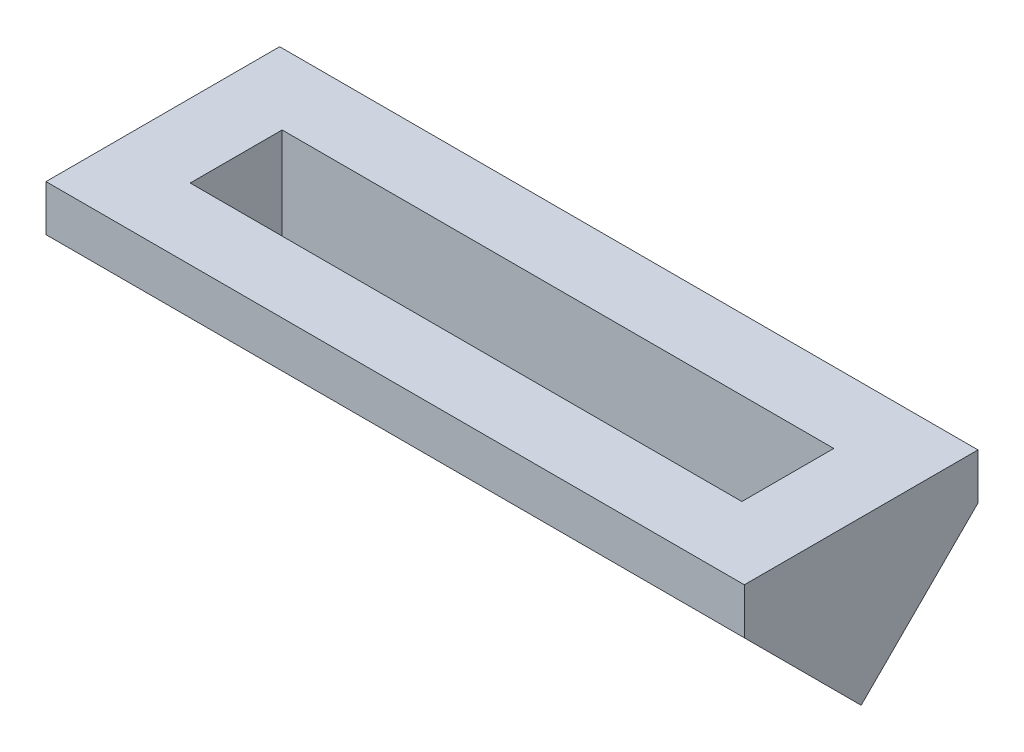
ISO-10303-21;
HEADER;
FILE_DESCRIPTION(('STEP AP214'),'2;1');
FILE_NAME('part.step','',(''),(''),'','','');
FILE_SCHEMA(('AUTOMOTIVE_DESIGN { 1 0 10303 214 1 1 1 1 }'));
ENDSEC;
DATA;
#1=APPLICATION_CONTEXT('core data for automotive mechanical design processes');
#2=APPLICATION_PROTOCOL_DEFINITION('international standard','automotive_design',2000,#1);
#3=PRODUCT_CONTEXT('',#1,'mechanical');
#4=PRODUCT('Part','Part','',(#3));
#5=PRODUCT_RELATED_PRODUCT_CATEGORY('part','',(#4));
#6=PRODUCT_DEFINITION_FORMATION('','',#4);
#7=PRODUCT_DEFINITION_CONTEXT('part definition',#1,'design');
#8=PRODUCT_DEFINITION('design','',#6,#7);
#9=PRODUCT_DEFINITION_SHAPE('','',#8);
#10=(LENGTH_UNIT() NAMED_UNIT(*) SI_UNIT(.MILLI.,.METRE.));
#11=(NAMED_UNIT(*) PLANE_ANGLE_UNIT() SI_UNIT($,.RADIAN.));
#12=(NAMED_UNIT(*) SI_UNIT($,.STERADIAN.) SOLID_ANGLE_UNIT());
#13=UNCERTAINTY_MEASURE_WITH_UNIT(LENGTH_MEASURE(1.E-05),#10,'distance_accuracy_value','');
#14=(GEOMETRIC_REPRESENTATION_CONTEXT(3) GLOBAL_UNCERTAINTY_ASSIGNED_CONTEXT((#13)) GLOBAL_UNIT_ASSIGNED_CONTEXT((#10,
#11,#12)) REPRESENTATION_CONTEXT('',''));
#15=CARTESIAN_POINT('',(0.,0.,0.));
#16=DIRECTION('',(0.,0.,1.));
#17=DIRECTION('',(1.,0.,0.));
#18=AXIS2_PLACEMENT_3D('',#15,#16,#17);
#19=CARTESIAN_POINT('',(0.,-50.8,5.82832430434869));
#20=DIRECTION('',(0.,0.707106781186546,0.707106781186548));
#21=DIRECTION('',(1.,0.,0.));
#22=AXIS2_PLACEMENT_3D('',#19,#20,#21);
#23=PLANE('',#22);
#24=DIRECTION('',(-1.,0.,0.));
#25=VECTOR('',#24,1.);
#26=CARTESIAN_POINT('',(0.,-44.9716756956512,0.));
#27=LINE('',#26,#25);
#28=CARTESIAN_POINT('',(-96.460563282851,-44.9716756956512,0.));
#29=VERTEX_POINT('',#28);
#30=CARTESIAN_POINT('',(96.460563282851,-44.9716756956512,0.));
#31=VERTEX_POINT('',#30);
#32=EDGE_CURVE('E200',#29,#31,#27,.F.);
#33=ORIENTED_EDGE('',*,*,#32,.F.);
#34=DIRECTION('',(0.,0.707106781186549,-0.707106781186546));
#35=VECTOR('',#34,1.);
#36=CARTESIAN_POINT('',(-96.460563282851,-50.8,5.82832430434869));
#37=LINE('',#36,#35);
#38=CARTESIAN_POINT('',(-96.460563282851,-12.6999999999998,-32.2716756956514));
#39=VERTEX_POINT('',#38);
#40=EDGE_CURVE('E239',#39,#29,#37,.F.);
#41=ORIENTED_EDGE('',*,*,#40,.F.);
#42=DIRECTION('',(-1.,0.,0.));
#43=VECTOR('',#42,1.);
#44=CARTESIAN_POINT('',(0.,-12.6999999999998,-32.2716756956514));
#45=LINE('',#44,#43);
#46=CARTESIAN_POINT('',(96.460563282851,-12.6999999999998,-32.2716756956514));
#47=VERTEX_POINT('',#46);
#48=EDGE_CURVE('E245',#47,#39,#45,.T.);
#49=ORIENTED_EDGE('',*,*,#48,.F.);
#50=DIRECTION('',(0.,-0.707106781186549,0.707106781186546));
#51=VECTOR('',#50,1.);
#52=CARTESIAN_POINT('',(96.460563282851,-47.8858378478256,2.91416215217436));
#53=LINE('',#52,#51);
#54=EDGE_CURVE('E233',#31,#47,#53,.F.);
#55=ORIENTED_EDGE('',*,*,#54,.F.);
#56=EDGE_LOOP('',(#33,#41,#49,#55));
#57=FACE_BOUND('',#56,.T.);
#58=DIRECTION('',(1.,0.,0.));
#59=VECTOR('',#58,1.);
#60=CARTESIAN_POINT('',(0.,-32.2716756956512,-12.7));
#61=LINE('',#60,#59);
#62=CARTESIAN_POINT('',(76.2,-32.2716756956513,-12.7));
#63=VERTEX_POINT('',#62);
#64=CARTESIAN_POINT('',(-76.2,-32.2716756956512,-12.7));
#65=VERTEX_POINT('',#64);
#66=EDGE_CURVE('E12',#63,#65,#61,.F.);
#67=ORIENTED_EDGE('',*,*,#66,.T.);
#68=DIRECTION('',(0.,0.707106781186549,-0.707106781186546));
#69=VECTOR('',#68,1.);
#70=CARTESIAN_POINT('',(-76.2,-50.8,5.82832430434869));
#71=LINE('',#70,#69);
#72=CARTESIAN_POINT('',(-76.2,-35.56,-9.41167569565126));
#73=VERTEX_POINT('',#72);
#74=EDGE_CURVE('E196',#65,#73,#71,.F.);
#75=ORIENTED_EDGE('',*,*,#74,.T.);
#76=DIRECTION('',(-1.,0.,0.));
#77=VECTOR('',#76,1.);
#78=CARTESIAN_POINT('',(0.,-35.56,-9.41167569565126));
#79=LINE('',#78,#77);
#80=CARTESIAN_POINT('',(76.2,-35.56,-9.41167569565126));
#81=VERTEX_POINT('',#80);
#82=EDGE_CURVE('E184',#73,#81,#79,.F.);
#83=ORIENTED_EDGE('',*,*,#82,.T.);
#84=DIRECTION('',(0.,0.707106781186549,-0.707106781186546));
#85=VECTOR('',#84,1.);
#86=CARTESIAN_POINT('',(76.2,-50.8,5.82832430434869));
#87=LINE('',#86,#85);
#88=EDGE_CURVE('E193',#63,#81,#87,.F.);
#89=ORIENTED_EDGE('',*,*,#88,.F.);
#90=EDGE_LOOP('',(#67,#75,#83,#89));
#91=FACE_BOUND('',#90,.T.);
#92=ADVANCED_FACE('F67',(#57,#91),#23,.F.);
#93=CARTESIAN_POINT('',(0.,0.,0.));
#94=DIRECTION('',(0.,1.,0.));
#95=DIRECTION('',(0.,0.,1.));
#96=AXIS2_PLACEMENT_3D('',#93,#94,#95);
#97=PLANE('',#96);
#98=DIRECTION('',(1.,0.,0.));
#99=VECTOR('',#98,1.);
#100=CARTESIAN_POINT('',(0.,0.,12.7));
#101=LINE('',#100,#99);
#102=CARTESIAN_POINT('',(-76.2,0.,12.7));
#103=VERTEX_POINT('',#102);
#104=CARTESIAN_POINT('',(76.2,0.,12.7));
#105=VERTEX_POINT('',#104);
#106=EDGE_CURVE('E83',#103,#105,#101,.T.);
#107=ORIENTED_EDGE('',*,*,#106,.F.);
#108=DIRECTION('',(0.,0.,-1.));
#109=VECTOR('',#108,1.);
#110=CARTESIAN_POINT('',(-76.2,0.,0.));
#111=LINE('',#110,#109);
#112=CARTESIAN_POINT('',(-76.2,0.,-12.7));
#113=VERTEX_POINT('',#112);
#114=EDGE_CURVE('E174',#103,#113,#111,.T.);
#115=ORIENTED_EDGE('',*,*,#114,.T.);
#116=DIRECTION('',(1.,0.,0.));
#117=VECTOR('',#116,1.);
#118=CARTESIAN_POINT('',(0.,0.,-12.7));
#119=LINE('',#118,#117);
#120=CARTESIAN_POINT('',(76.2,0.,-12.7));
#121=VERTEX_POINT('',#120);
#122=EDGE_CURVE('E157',#113,#121,#119,.T.);
#123=ORIENTED_EDGE('',*,*,#122,.T.);
#124=DIRECTION('',(0.,0.,-1.));
#125=VECTOR('',#124,1.);
#126=CARTESIAN_POINT('',(76.2,0.,0.));
#127=LINE('',#126,#125);
#128=EDGE_CURVE('E166',#105,#121,#127,.T.);
#129=ORIENTED_EDGE('',*,*,#128,.F.);
#130=EDGE_LOOP('',(#107,#115,#123,#129));
#131=FACE_BOUND('',#130,.T.);
#132=DIRECTION('',(1.,0.,0.));
#133=VECTOR('',#132,1.);
#134=CARTESIAN_POINT('',(0.,0.,32.2716756956514));
#135=LINE('',#134,#133);
#136=CARTESIAN_POINT('',(-96.460563282851,0.,32.2716756956514));
#137=VERTEX_POINT('',#136);
#138=CARTESIAN_POINT('',(96.460563282851,0.,32.2716756956514));
#139=VERTEX_POINT('',#138);
#140=EDGE_CURVE('E201',#137,#139,#135,.T.);
#141=ORIENTED_EDGE('',*,*,#140,.T.);
#142=DIRECTION('',(0.,0.,-1.));
#143=VECTOR('',#142,1.);
#144=CARTESIAN_POINT('',(96.460563282851,0.,0.));
#145=LINE('',#144,#143);
#146=CARTESIAN_POINT('',(96.460563282851,0.,-32.2716756956514));
#147=VERTEX_POINT('',#146);
#148=EDGE_CURVE('E205',#139,#147,#145,.T.);
#149=ORIENTED_EDGE('',*,*,#148,.T.);
#150=DIRECTION('',(1.,0.,0.));
#151=VECTOR('',#150,1.);
#152=CARTESIAN_POINT('',(0.,0.,-32.2716756956514));
#153=LINE('',#152,#151);
#154=CARTESIAN_POINT('',(-96.460563282851,0.,-32.2716756956514));
#155=VERTEX_POINT('',#154);
#156=EDGE_CURVE('E209',#155,#147,#153,.T.);
#157=ORIENTED_EDGE('',*,*,#156,.F.);
#158=DIRECTION('',(0.,0.,-1.));
#159=VECTOR('',#158,1.);
#160=CARTESIAN_POINT('',(-96.460563282851,0.,0.));
#161=LINE('',#160,#159);
#162=EDGE_CURVE('E213',#137,#155,#161,.T.);
#163=ORIENTED_EDGE('',*,*,#162,.F.);
#164=EDGE_LOOP('',(#141,#149,#157,#163));
#165=FACE_BOUND('',#164,.T.);
#166=ADVANCED_FACE('F171',(#131,#165),#97,.T.);
#167=CARTESIAN_POINT('',(-96.460563282851,-50.8,0.));
#168=DIRECTION('',(1.,0.,0.));
#169=DIRECTION('',(0.,0.,-1.));
#170=AXIS2_PLACEMENT_3D('',#167,#168,#169);
#171=PLANE('',#170);
#172=ORIENTED_EDGE('',*,*,#40,.T.);
#173=DIRECTION('',(0.,0.707106781186546,0.707106781186549));
#174=VECTOR('',#173,1.);
#175=CARTESIAN_POINT('',(-96.460563282851,-12.6999999999999,32.2716756956514));
#176=LINE('',#175,#174);
#177=CARTESIAN_POINT('',(-96.460563282851,-12.6999999999999,32.2716756956514));
#178=VERTEX_POINT('',#177);
#179=EDGE_CURVE('E242',#29,#178,#176,.T.);
#180=ORIENTED_EDGE('',*,*,#179,.T.);
#181=DIRECTION('',(0.,1.,0.));
#182=VECTOR('',#181,1.);
#183=CARTESIAN_POINT('',(-96.460563282851,-50.8,32.2716756956514));
#184=LINE('',#183,#182);
#185=EDGE_CURVE('E218',#178,#137,#184,.T.);
#186=ORIENTED_EDGE('',*,*,#185,.T.);
#187=ORIENTED_EDGE('',*,*,#162,.T.);
#188=DIRECTION('',(0.,1.,0.));
#189=VECTOR('',#188,1.);
#190=CARTESIAN_POINT('',(-96.460563282851,-50.8,-32.2716756956514));
#191=LINE('',#190,#189);
#192=EDGE_CURVE('E222',#39,#155,#191,.T.);
#193=ORIENTED_EDGE('',*,*,#192,.F.);
#194=EDGE_LOOP('',(#172,#180,#186,#187,#193));
#195=FACE_BOUND('',#194,.T.);
#196=ADVANCED_FACE('F282',(#195),#171,.F.);
#197=CARTESIAN_POINT('',(0.,-50.8,32.2716756956514));
#198=DIRECTION('',(0.,0.,1.));
#199=DIRECTION('',(1.,0.,0.));
#200=AXIS2_PLACEMENT_3D('',#197,#198,#199);
#201=PLANE('',#200);
#202=ORIENTED_EDGE('',*,*,#185,.F.);
#203=DIRECTION('',(1.,0.,0.));
#204=VECTOR('',#203,1.);
#205=CARTESIAN_POINT('',(96.460563282851,-12.6999999999999,32.2716756956514));
#206=LINE('',#205,#204);
#207=CARTESIAN_POINT('',(96.460563282851,-12.6999999999999,32.2716756956514));
#208=VERTEX_POINT('',#207);
#209=EDGE_CURVE('E221',#178,#208,#206,.T.);
#210=ORIENTED_EDGE('',*,*,#209,.T.);
#211=DIRECTION('',(0.,1.,0.));
#212=VECTOR('',#211,1.);
#213=CARTESIAN_POINT('',(96.460563282851,-50.8,32.2716756956514));
#214=LINE('',#213,#212);
#215=EDGE_CURVE('E217',#208,#139,#214,.T.);
#216=ORIENTED_EDGE('',*,*,#215,.T.);
#217=ORIENTED_EDGE('',*,*,#140,.F.);
#218=EDGE_LOOP('',(#202,#210,#216,#217));
#219=FACE_BOUND('',#218,.T.);
#220=ADVANCED_FACE('F287',(#219),#201,.T.);
#221=CARTESIAN_POINT('',(96.460563282851,-50.8,0.));
#222=DIRECTION('',(1.,0.,0.));
#223=DIRECTION('',(0.,0.,-1.));
#224=AXIS2_PLACEMENT_3D('',#221,#222,#223);
#225=PLANE('',#224);
#226=ORIENTED_EDGE('',*,*,#215,.F.);
#227=DIRECTION('',(0.,-0.707106781186546,-0.707106781186549));
#228=VECTOR('',#227,1.);
#229=CARTESIAN_POINT('',(96.460563282851,-47.8858378478256,-2.91416215217439));
#230=LINE('',#229,#228);
#231=EDGE_CURVE('E236',#208,#31,#230,.T.);
#232=ORIENTED_EDGE('',*,*,#231,.T.);
#233=ORIENTED_EDGE('',*,*,#54,.T.);
#234=DIRECTION('',(0.,1.,0.));
#235=VECTOR('',#234,1.);
#236=CARTESIAN_POINT('',(96.460563282851,-50.8,-32.2716756956514));
#237=LINE('',#236,#235);
#238=EDGE_CURVE('E225',#47,#147,#237,.T.);
#239=ORIENTED_EDGE('',*,*,#238,.T.);
#240=ORIENTED_EDGE('',*,*,#148,.F.);
#241=EDGE_LOOP('',(#226,#232,#233,#239,#240));
#242=FACE_BOUND('',#241,.T.);
#243=ADVANCED_FACE('F295',(#242),#225,.T.);
#244=CARTESIAN_POINT('',(0.,-50.8,-32.2716756956514));
#245=DIRECTION('',(0.,0.,1.));
#246=DIRECTION('',(1.,0.,0.));
#247=AXIS2_PLACEMENT_3D('',#244,#245,#246);
#248=PLANE('',#247);
#249=ORIENTED_EDGE('',*,*,#238,.F.);
#250=ORIENTED_EDGE('',*,*,#48,.T.);
#251=ORIENTED_EDGE('',*,*,#192,.T.);
#252=ORIENTED_EDGE('',*,*,#156,.T.);
#253=EDGE_LOOP('',(#249,#250,#251,#252));
#254=FACE_BOUND('',#253,.T.);
#255=ADVANCED_FACE('F300',(#254),#248,.F.);
#256=CARTESIAN_POINT('',(0.,-12.6999999999999,32.2716756956514));
#257=DIRECTION('',(0.,-0.707106781186548,0.707106781186546));
#258=DIRECTION('',(-1.,0.,0.));
#259=AXIS2_PLACEMENT_3D('',#256,#257,#258);
#260=PLANE('',#259);
#261=DIRECTION('',(-1.,0.,0.));
#262=VECTOR('',#261,1.);
#263=CARTESIAN_POINT('',(0.,-32.2716756956512,12.7));
#264=LINE('',#263,#262);
#265=CARTESIAN_POINT('',(76.2,-32.2716756956512,12.7));
#266=VERTEX_POINT('',#265);
#267=CARTESIAN_POINT('',(-76.2,-32.2716756956512,12.7));
#268=VERTEX_POINT('',#267);
#269=EDGE_CURVE('E76',#266,#268,#264,.T.);
#270=ORIENTED_EDGE('',*,*,#269,.F.);
#271=DIRECTION('',(0.,0.707106781186546,0.707106781186549));
#272=VECTOR('',#271,1.);
#273=CARTESIAN_POINT('',(76.2,-12.6999999999999,32.2716756956514));
#274=LINE('',#273,#272);
#275=CARTESIAN_POINT('',(76.2,-35.56,9.41167569565124));
#276=VERTEX_POINT('',#275);
#277=EDGE_CURVE('E255',#276,#266,#274,.T.);
#278=ORIENTED_EDGE('',*,*,#277,.F.);
#279=DIRECTION('',(-1.,0.,0.));
#280=VECTOR('',#279,1.);
#281=CARTESIAN_POINT('',(0.,-35.56,9.41167569565124));
#282=LINE('',#281,#280);
#283=CARTESIAN_POINT('',(-76.2,-35.56,9.41167569565124));
#284=VERTEX_POINT('',#283);
#285=EDGE_CURVE('E248',#276,#284,#282,.T.);
#286=ORIENTED_EDGE('',*,*,#285,.T.);
#287=DIRECTION('',(0.,0.707106781186546,0.707106781186549));
#288=VECTOR('',#287,1.);
#289=CARTESIAN_POINT('',(-76.2,-12.6999999999999,32.2716756956514));
#290=LINE('',#289,#288);
#291=EDGE_CURVE('E258',#284,#268,#290,.T.);
#292=ORIENTED_EDGE('',*,*,#291,.T.);
#293=EDGE_LOOP('',(#270,#278,#286,#292));
#294=FACE_BOUND('',#293,.T.);
#295=ORIENTED_EDGE('',*,*,#179,.F.);
#296=ORIENTED_EDGE('',*,*,#32,.T.);
#297=ORIENTED_EDGE('',*,*,#231,.F.);
#298=ORIENTED_EDGE('',*,*,#209,.F.);
#299=EDGE_LOOP('',(#295,#296,#297,#298));
#300=FACE_BOUND('',#299,.T.);
#301=ADVANCED_FACE('F271',(#294,#300),#260,.T.);
#302=CARTESIAN_POINT('',(0.,-35.56,12.7));
#303=DIRECTION('',(0.,0.,1.));
#304=DIRECTION('',(1.,0.,0.));
#305=AXIS2_PLACEMENT_3D('',#302,#303,#304);
#306=PLANE('',#305);
#307=ORIENTED_EDGE('',*,*,#269,.T.);
#308=DIRECTION('',(0.,1.,0.));
#309=VECTOR('',#308,1.);
#310=CARTESIAN_POINT('',(-76.2,-35.56,12.7));
#311=LINE('',#310,#309);
#312=EDGE_CURVE('E181',#268,#103,#311,.T.);
#313=ORIENTED_EDGE('',*,*,#312,.T.);
#314=ORIENTED_EDGE('',*,*,#106,.T.);
#315=DIRECTION('',(0.,1.,0.));
#316=VECTOR('',#315,1.);
#317=CARTESIAN_POINT('',(76.2,-35.56,12.7));
#318=LINE('',#317,#316);
#319=EDGE_CURVE('E163',#266,#105,#318,.T.);
#320=ORIENTED_EDGE('',*,*,#319,.F.);
#321=EDGE_LOOP('',(#307,#313,#314,#320));
#322=FACE_BOUND('',#321,.T.);
#323=ADVANCED_FACE('F264',(#322),#306,.F.);
#324=CARTESIAN_POINT('',(-76.2,-35.56,0.));
#325=DIRECTION('',(1.,0.,0.));
#326=DIRECTION('',(0.,0.,-1.));
#327=AXIS2_PLACEMENT_3D('',#324,#325,#326);
#328=PLANE('',#327);
#329=DIRECTION('',(0.,1.,0.));
#330=VECTOR('',#329,1.);
#331=CARTESIAN_POINT('',(-76.2,-35.56,-12.7));
#332=LINE('',#331,#330);
#333=EDGE_CURVE('E162',#65,#113,#332,.T.);
#334=ORIENTED_EDGE('',*,*,#333,.T.);
#335=ORIENTED_EDGE('',*,*,#114,.F.);
#336=ORIENTED_EDGE('',*,*,#312,.F.);
#337=ORIENTED_EDGE('',*,*,#291,.F.);
#338=DIRECTION('',(0.,0.,-1.));
#339=VECTOR('',#338,1.);
#340=CARTESIAN_POINT('',(-76.2,-35.56,0.));
#341=LINE('',#340,#339);
#342=EDGE_CURVE('E189',#284,#73,#341,.T.);
#343=ORIENTED_EDGE('',*,*,#342,.T.);
#344=ORIENTED_EDGE('',*,*,#74,.F.);
#345=EDGE_LOOP('',(#334,#335,#336,#337,#343,#344));
#346=FACE_BOUND('',#345,.T.);
#347=ADVANCED_FACE('F269',(#346),#328,.T.);
#348=CARTESIAN_POINT('',(0.,-35.56,-12.7));
#349=DIRECTION('',(0.,0.,1.));
#350=DIRECTION('',(1.,0.,0.));
#351=AXIS2_PLACEMENT_3D('',#348,#349,#350);
#352=PLANE('',#351);
#353=DIRECTION('',(0.,1.,0.));
#354=VECTOR('',#353,1.);
#355=CARTESIAN_POINT('',(76.2,-35.56,-12.7));
#356=LINE('',#355,#354);
#357=EDGE_CURVE('E152',#63,#121,#356,.T.);
#358=ORIENTED_EDGE('',*,*,#357,.T.);
#359=ORIENTED_EDGE('',*,*,#122,.F.);
#360=ORIENTED_EDGE('',*,*,#333,.F.);
#361=ORIENTED_EDGE('',*,*,#66,.F.);
#362=EDGE_LOOP('',(#358,#359,#360,#361));
#363=FACE_BOUND('',#362,.T.);
#364=ADVANCED_FACE('F154',(#363),#352,.T.);
#365=CARTESIAN_POINT('',(76.2,-35.56,0.));
#366=DIRECTION('',(1.,0.,0.));
#367=DIRECTION('',(0.,0.,-1.));
#368=AXIS2_PLACEMENT_3D('',#365,#366,#367);
#369=PLANE('',#368);
#370=ORIENTED_EDGE('',*,*,#88,.T.);
#371=DIRECTION('',(0.,0.,-1.));
#372=VECTOR('',#371,1.);
#373=CARTESIAN_POINT('',(76.2,-35.56,0.));
#374=LINE('',#373,#372);
#375=EDGE_CURVE('E91',#276,#81,#374,.T.);
#376=ORIENTED_EDGE('',*,*,#375,.F.);
#377=ORIENTED_EDGE('',*,*,#277,.T.);
#378=ORIENTED_EDGE('',*,*,#319,.T.);
#379=ORIENTED_EDGE('',*,*,#128,.T.);
#380=ORIENTED_EDGE('',*,*,#357,.F.);
#381=EDGE_LOOP('',(#370,#376,#377,#378,#379,#380));
#382=FACE_BOUND('',#381,.T.);
#383=ADVANCED_FACE('F167',(#382),#369,.F.);
#384=CARTESIAN_POINT('',(0.,-35.56,0.));
#385=DIRECTION('',(0.,1.,0.));
#386=DIRECTION('',(0.,0.,1.));
#387=AXIS2_PLACEMENT_3D('',#384,#385,#386);
#388=PLANE('',#387);
#389=ORIENTED_EDGE('',*,*,#342,.F.);
#390=ORIENTED_EDGE('',*,*,#285,.F.);
#391=ORIENTED_EDGE('',*,*,#375,.T.);
#392=ORIENTED_EDGE('',*,*,#82,.F.);
#393=EDGE_LOOP('',(#389,#390,#391,#392));
#394=FACE_BOUND('',#393,.T.);
#395=ADVANCED_FACE('F273',(#394),#388,.T.);
#396=CLOSED_SHELL('',(#92,#166,#196,#220,#243,#255,#301,#323,#347,#364,#383,#395));
#397=MANIFOLD_SOLID_BREP('B2',#396);
#398=ADVANCED_BREP_SHAPE_REPRESENTATION('',(#18,#397),#14);
#399=SHAPE_DEFINITION_REPRESENTATION(#9,#398);
ENDSEC;
END-ISO-10303-21;
